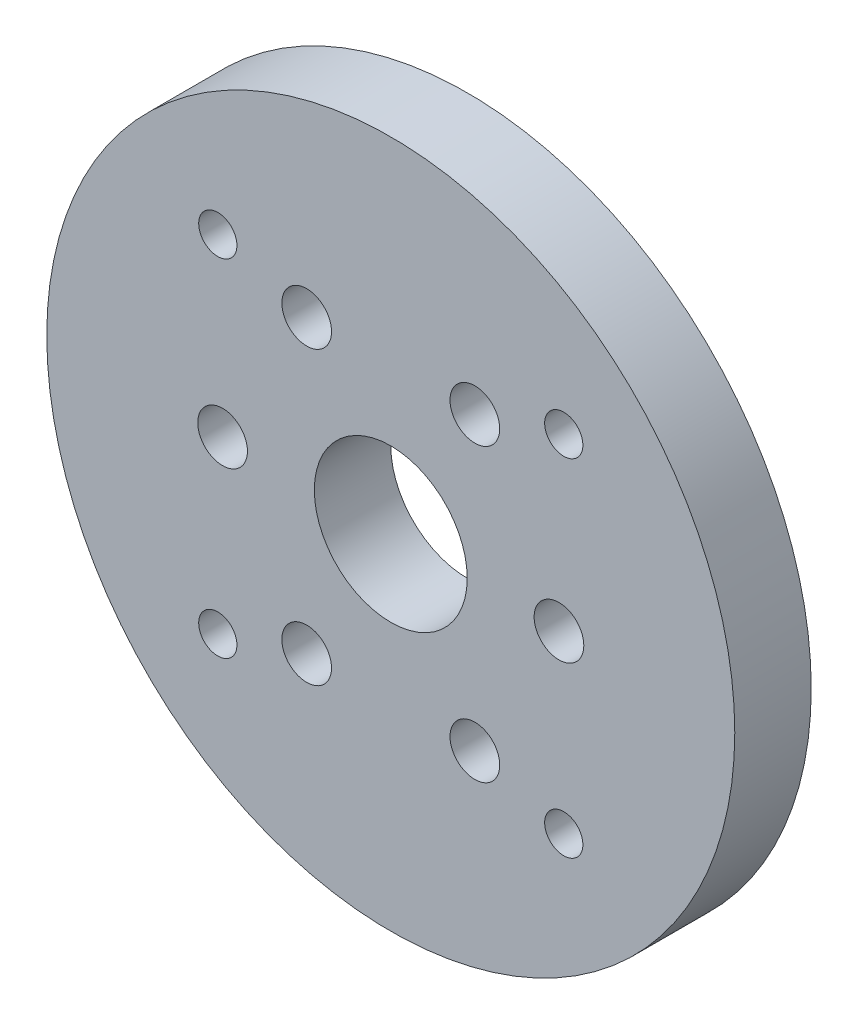
ISO-10303-21;
HEADER;
FILE_DESCRIPTION(('STEP AP214'),'2;1');
FILE_NAME('part.step','',(''),(''),'','','');
FILE_SCHEMA(('AUTOMOTIVE_DESIGN { 1 0 10303 214 1 1 1 1 }'));
ENDSEC;
DATA;
#1=APPLICATION_CONTEXT('core data for automotive mechanical design processes');
#2=APPLICATION_PROTOCOL_DEFINITION('international standard','automotive_design',2000,#1);
#3=PRODUCT_CONTEXT('',#1,'mechanical');
#4=PRODUCT('Part','Part','',(#3));
#5=PRODUCT_RELATED_PRODUCT_CATEGORY('part','',(#4));
#6=PRODUCT_DEFINITION_FORMATION('','',#4);
#7=PRODUCT_DEFINITION_CONTEXT('part definition',#1,'design');
#8=PRODUCT_DEFINITION('design','',#6,#7);
#9=PRODUCT_DEFINITION_SHAPE('','',#8);
#10=(LENGTH_UNIT() NAMED_UNIT(*) SI_UNIT(.MILLI.,.METRE.));
#11=(NAMED_UNIT(*) PLANE_ANGLE_UNIT() SI_UNIT($,.RADIAN.));
#12=(NAMED_UNIT(*) SI_UNIT($,.STERADIAN.) SOLID_ANGLE_UNIT());
#13=UNCERTAINTY_MEASURE_WITH_UNIT(LENGTH_MEASURE(1.E-05),#10,'distance_accuracy_value','');
#14=(GEOMETRIC_REPRESENTATION_CONTEXT(3) GLOBAL_UNCERTAINTY_ASSIGNED_CONTEXT((#13)) GLOBAL_UNIT_ASSIGNED_CONTEXT((#10,
#11,#12)) REPRESENTATION_CONTEXT('',''));
#15=CARTESIAN_POINT('',(0.,0.,0.));
#16=DIRECTION('',(0.,0.,1.));
#17=DIRECTION('',(1.,0.,0.));
#18=AXIS2_PLACEMENT_3D('',#15,#16,#17);
#19=CARTESIAN_POINT('',(0.,0.,10.));
#20=DIRECTION('',(0.,0.,-1.));
#21=DIRECTION('',(-1.,0.,0.));
#22=AXIS2_PLACEMENT_3D('',#19,#20,#21);
#23=CYLINDRICAL_SURFACE('',#22,45.);
#24=CARTESIAN_POINT('',(0.,0.,10.));
#25=DIRECTION('',(0.,0.,1.));
#26=DIRECTION('',(1.,0.,0.));
#27=AXIS2_PLACEMENT_3D('',#24,#25,#26);
#28=CIRCLE('',#27,45.);
#29=CARTESIAN_POINT('',(45.,0.,10.));
#30=VERTEX_POINT('',#29);
#31=EDGE_CURVE('E10',#30,#30,#28,.T.);
#32=ORIENTED_EDGE('',*,*,#31,.F.);
#33=EDGE_LOOP('',(#32));
#34=FACE_BOUND('',#33,.T.);
#35=CARTESIAN_POINT('',(0.,0.,0.));
#36=DIRECTION('',(0.,0.,1.));
#37=DIRECTION('',(1.,0.,0.));
#38=AXIS2_PLACEMENT_3D('',#35,#36,#37);
#39=CIRCLE('',#38,45.);
#40=CARTESIAN_POINT('',(45.,0.,0.));
#41=VERTEX_POINT('',#40);
#42=EDGE_CURVE('E48',#41,#41,#39,.T.);
#43=ORIENTED_EDGE('',*,*,#42,.T.);
#44=EDGE_LOOP('',(#43));
#45=FACE_BOUND('',#44,.T.);
#46=ADVANCED_FACE('F45',(#34,#45),#23,.T.);
#47=CARTESIAN_POINT('',(0.,0.,10.));
#48=DIRECTION('',(0.,0.,1.));
#49=DIRECTION('',(1.,0.,0.));
#50=AXIS2_PLACEMENT_3D('',#47,#48,#49);
#51=PLANE('',#50);
#52=CARTESIAN_POINT('',(-22.6274169979695,22.6274169979695,10.));
#53=DIRECTION('',(0.,0.,1.));
#54=DIRECTION('',(1.,0.,0.));
#55=AXIS2_PLACEMENT_3D('',#52,#53,#54);
#56=CIRCLE('',#55,2.5);
#57=CARTESIAN_POINT('',(-20.1274169979695,22.6274169979695,10.));
#58=VERTEX_POINT('',#57);
#59=EDGE_CURVE('E57',#58,#58,#56,.T.);
#60=ORIENTED_EDGE('',*,*,#59,.F.);
#61=EDGE_LOOP('',(#60));
#62=FACE_BOUND('',#61,.T.);
#63=CARTESIAN_POINT('',(22.6274169979695,22.6274169979695,10.));
#64=DIRECTION('',(0.,0.,1.));
#65=DIRECTION('',(1.,0.,0.));
#66=AXIS2_PLACEMENT_3D('',#63,#64,#65);
#67=CIRCLE('',#66,2.5);
#68=CARTESIAN_POINT('',(25.1274169979695,22.6274169979695,10.));
#69=VERTEX_POINT('',#68);
#70=EDGE_CURVE('E62',#69,#69,#67,.T.);
#71=ORIENTED_EDGE('',*,*,#70,.F.);
#72=EDGE_LOOP('',(#71));
#73=FACE_BOUND('',#72,.T.);
#74=CARTESIAN_POINT('',(11.,-19.0525588832576,10.));
#75=DIRECTION('',(0.,0.,1.));
#76=DIRECTION('',(1.,0.,0.));
#77=AXIS2_PLACEMENT_3D('',#74,#75,#76);
#78=CIRCLE('',#77,3.25);
#79=CARTESIAN_POINT('',(14.25,-19.0525588832576,10.));
#80=VERTEX_POINT('',#79);
#81=EDGE_CURVE('E66',#80,#80,#78,.T.);
#82=ORIENTED_EDGE('',*,*,#81,.F.);
#83=EDGE_LOOP('',(#82));
#84=FACE_BOUND('',#83,.T.);
#85=CARTESIAN_POINT('',(-11.,-19.0525588832576,10.));
#86=DIRECTION('',(0.,0.,1.));
#87=DIRECTION('',(1.,0.,0.));
#88=AXIS2_PLACEMENT_3D('',#85,#86,#87);
#89=CIRCLE('',#88,3.25);
#90=CARTESIAN_POINT('',(-7.75000000000001,-19.0525588832576,10.));
#91=VERTEX_POINT('',#90);
#92=EDGE_CURVE('E70',#91,#91,#89,.T.);
#93=ORIENTED_EDGE('',*,*,#92,.F.);
#94=EDGE_LOOP('',(#93));
#95=FACE_BOUND('',#94,.T.);
#96=CARTESIAN_POINT('',(-22.,0.,10.));
#97=DIRECTION('',(0.,0.,1.));
#98=DIRECTION('',(1.,0.,0.));
#99=AXIS2_PLACEMENT_3D('',#96,#97,#98);
#100=CIRCLE('',#99,3.25);
#101=CARTESIAN_POINT('',(-18.75,0.,10.));
#102=VERTEX_POINT('',#101);
#103=EDGE_CURVE('E74',#102,#102,#100,.T.);
#104=ORIENTED_EDGE('',*,*,#103,.F.);
#105=EDGE_LOOP('',(#104));
#106=FACE_BOUND('',#105,.T.);
#107=CARTESIAN_POINT('',(-11.,19.0525588832577,10.));
#108=DIRECTION('',(0.,0.,1.));
#109=DIRECTION('',(1.,0.,0.));
#110=AXIS2_PLACEMENT_3D('',#107,#108,#109);
#111=CIRCLE('',#110,3.25);
#112=CARTESIAN_POINT('',(-7.74999999999999,19.0525588832577,10.));
#113=VERTEX_POINT('',#112);
#114=EDGE_CURVE('E78',#113,#113,#111,.T.);
#115=ORIENTED_EDGE('',*,*,#114,.F.);
#116=EDGE_LOOP('',(#115));
#117=FACE_BOUND('',#116,.T.);
#118=CARTESIAN_POINT('',(11.,19.0525588832576,10.));
#119=DIRECTION('',(0.,0.,1.));
#120=DIRECTION('',(1.,0.,0.));
#121=AXIS2_PLACEMENT_3D('',#118,#119,#120);
#122=CIRCLE('',#121,3.25);
#123=CARTESIAN_POINT('',(14.25,19.0525588832576,10.));
#124=VERTEX_POINT('',#123);
#125=EDGE_CURVE('E82',#124,#124,#122,.T.);
#126=ORIENTED_EDGE('',*,*,#125,.F.);
#127=EDGE_LOOP('',(#126));
#128=FACE_BOUND('',#127,.T.);
#129=CARTESIAN_POINT('',(22.,0.,10.));
#130=DIRECTION('',(0.,0.,1.));
#131=DIRECTION('',(1.,0.,0.));
#132=AXIS2_PLACEMENT_3D('',#129,#130,#131);
#133=CIRCLE('',#132,3.25);
#134=CARTESIAN_POINT('',(25.25,0.,10.));
#135=VERTEX_POINT('',#134);
#136=EDGE_CURVE('E86',#135,#135,#133,.T.);
#137=ORIENTED_EDGE('',*,*,#136,.F.);
#138=EDGE_LOOP('',(#137));
#139=FACE_BOUND('',#138,.T.);
#140=CARTESIAN_POINT('',(-22.6274169979695,-22.6274169979695,10.));
#141=DIRECTION('',(0.,0.,1.));
#142=DIRECTION('',(1.,0.,0.));
#143=AXIS2_PLACEMENT_3D('',#140,#141,#142);
#144=CIRCLE('',#143,2.5);
#145=CARTESIAN_POINT('',(-20.1274169979695,-22.6274169979695,10.));
#146=VERTEX_POINT('',#145);
#147=EDGE_CURVE('E90',#146,#146,#144,.T.);
#148=ORIENTED_EDGE('',*,*,#147,.F.);
#149=EDGE_LOOP('',(#148));
#150=FACE_BOUND('',#149,.T.);
#151=CARTESIAN_POINT('',(22.6274169979695,-22.6274169979695,10.));
#152=DIRECTION('',(0.,0.,1.));
#153=DIRECTION('',(1.,0.,0.));
#154=AXIS2_PLACEMENT_3D('',#151,#152,#153);
#155=CIRCLE('',#154,2.5);
#156=CARTESIAN_POINT('',(25.1274169979695,-22.6274169979695,10.));
#157=VERTEX_POINT('',#156);
#158=EDGE_CURVE('E94',#157,#157,#155,.T.);
#159=ORIENTED_EDGE('',*,*,#158,.F.);
#160=EDGE_LOOP('',(#159));
#161=FACE_BOUND('',#160,.T.);
#162=CARTESIAN_POINT('',(0.,0.,10.));
#163=DIRECTION('',(0.,0.,1.));
#164=DIRECTION('',(1.,0.,0.));
#165=AXIS2_PLACEMENT_3D('',#162,#163,#164);
#166=CIRCLE('',#165,10.);
#167=CARTESIAN_POINT('',(10.,0.,10.));
#168=VERTEX_POINT('',#167);
#169=EDGE_CURVE('E98',#168,#168,#166,.T.);
#170=ORIENTED_EDGE('',*,*,#169,.F.);
#171=EDGE_LOOP('',(#170));
#172=FACE_BOUND('',#171,.T.);
#173=ORIENTED_EDGE('',*,*,#31,.T.);
#174=EDGE_LOOP('',(#173));
#175=FACE_BOUND('',#174,.T.);
#176=ADVANCED_FACE('F153',(#62,#73,#84,#95,#106,#117,#128,#139,#150,#161,#172,#175),#51,.T.);
#177=CARTESIAN_POINT('',(0.,0.,0.));
#178=DIRECTION('',(0.,0.,1.));
#179=DIRECTION('',(1.,0.,0.));
#180=AXIS2_PLACEMENT_3D('',#177,#178,#179);
#181=PLANE('',#180);
#182=CARTESIAN_POINT('',(-22.6274169979695,22.6274169979695,0.));
#183=DIRECTION('',(0.,0.,-1.));
#184=DIRECTION('',(-1.,0.,0.));
#185=AXIS2_PLACEMENT_3D('',#182,#183,#184);
#186=CIRCLE('',#185,2.5);
#187=CARTESIAN_POINT('',(-25.1274169979695,22.6274169979695,0.));
#188=VERTEX_POINT('',#187);
#189=EDGE_CURVE('E123',#188,#188,#186,.T.);
#190=ORIENTED_EDGE('',*,*,#189,.F.);
#191=EDGE_LOOP('',(#190));
#192=FACE_BOUND('',#191,.T.);
#193=CARTESIAN_POINT('',(22.6274169979695,22.6274169979695,0.));
#194=DIRECTION('',(0.,0.,-1.));
#195=DIRECTION('',(-1.,0.,0.));
#196=AXIS2_PLACEMENT_3D('',#193,#194,#195);
#197=CIRCLE('',#196,2.5);
#198=CARTESIAN_POINT('',(20.1274169979695,22.6274169979695,0.));
#199=VERTEX_POINT('',#198);
#200=EDGE_CURVE('E127',#199,#199,#197,.T.);
#201=ORIENTED_EDGE('',*,*,#200,.F.);
#202=EDGE_LOOP('',(#201));
#203=FACE_BOUND('',#202,.T.);
#204=CARTESIAN_POINT('',(11.,-19.0525588832576,0.));
#205=DIRECTION('',(0.,0.,-1.));
#206=DIRECTION('',(-1.,0.,0.));
#207=AXIS2_PLACEMENT_3D('',#204,#205,#206);
#208=CIRCLE('',#207,3.25);
#209=CARTESIAN_POINT('',(7.75,-19.0525588832576,0.));
#210=VERTEX_POINT('',#209);
#211=EDGE_CURVE('E132',#210,#210,#208,.T.);
#212=ORIENTED_EDGE('',*,*,#211,.F.);
#213=EDGE_LOOP('',(#212));
#214=FACE_BOUND('',#213,.T.);
#215=CARTESIAN_POINT('',(-11.,-19.0525588832576,0.));
#216=DIRECTION('',(0.,0.,-1.));
#217=DIRECTION('',(-1.,0.,0.));
#218=AXIS2_PLACEMENT_3D('',#215,#216,#217);
#219=CIRCLE('',#218,3.25);
#220=CARTESIAN_POINT('',(-14.25,-19.0525588832576,0.));
#221=VERTEX_POINT('',#220);
#222=EDGE_CURVE('E112',#221,#221,#219,.T.);
#223=ORIENTED_EDGE('',*,*,#222,.F.);
#224=EDGE_LOOP('',(#223));
#225=FACE_BOUND('',#224,.T.);
#226=CARTESIAN_POINT('',(-22.,0.,0.));
#227=DIRECTION('',(0.,0.,-1.));
#228=DIRECTION('',(-1.,0.,0.));
#229=AXIS2_PLACEMENT_3D('',#226,#227,#228);
#230=CIRCLE('',#229,3.25);
#231=CARTESIAN_POINT('',(-25.25,0.,0.));
#232=VERTEX_POINT('',#231);
#233=EDGE_CURVE('E107',#232,#232,#230,.T.);
#234=ORIENTED_EDGE('',*,*,#233,.F.);
#235=EDGE_LOOP('',(#234));
#236=FACE_BOUND('',#235,.T.);
#237=CARTESIAN_POINT('',(-11.,19.0525588832577,0.));
#238=DIRECTION('',(0.,0.,-1.));
#239=DIRECTION('',(-1.,0.,0.));
#240=AXIS2_PLACEMENT_3D('',#237,#238,#239);
#241=CIRCLE('',#240,3.25);
#242=CARTESIAN_POINT('',(-14.25,19.0525588832577,0.));
#243=VERTEX_POINT('',#242);
#244=EDGE_CURVE('E111',#243,#243,#241,.T.);
#245=ORIENTED_EDGE('',*,*,#244,.F.);
#246=EDGE_LOOP('',(#245));
#247=FACE_BOUND('',#246,.T.);
#248=CARTESIAN_POINT('',(11.,19.0525588832576,0.));
#249=DIRECTION('',(0.,0.,-1.));
#250=DIRECTION('',(-1.,0.,0.));
#251=AXIS2_PLACEMENT_3D('',#248,#249,#250);
#252=CIRCLE('',#251,3.25);
#253=CARTESIAN_POINT('',(7.75,19.0525588832576,0.));
#254=VERTEX_POINT('',#253);
#255=EDGE_CURVE('E116',#254,#254,#252,.T.);
#256=ORIENTED_EDGE('',*,*,#255,.F.);
#257=EDGE_LOOP('',(#256));
#258=FACE_BOUND('',#257,.T.);
#259=CARTESIAN_POINT('',(22.,0.,0.));
#260=DIRECTION('',(0.,0.,-1.));
#261=DIRECTION('',(-1.,0.,0.));
#262=AXIS2_PLACEMENT_3D('',#259,#260,#261);
#263=CIRCLE('',#262,3.25);
#264=CARTESIAN_POINT('',(18.75,0.,0.));
#265=VERTEX_POINT('',#264);
#266=EDGE_CURVE('E106',#265,#265,#263,.T.);
#267=ORIENTED_EDGE('',*,*,#266,.F.);
#268=EDGE_LOOP('',(#267));
#269=FACE_BOUND('',#268,.T.);
#270=CARTESIAN_POINT('',(-22.6274169979695,-22.6274169979695,0.));
#271=DIRECTION('',(0.,0.,-1.));
#272=DIRECTION('',(-1.,0.,0.));
#273=AXIS2_PLACEMENT_3D('',#270,#271,#272);
#274=CIRCLE('',#273,2.5);
#275=CARTESIAN_POINT('',(-25.1274169979695,-22.6274169979695,0.));
#276=VERTEX_POINT('',#275);
#277=EDGE_CURVE('E128',#276,#276,#274,.T.);
#278=ORIENTED_EDGE('',*,*,#277,.F.);
#279=EDGE_LOOP('',(#278));
#280=FACE_BOUND('',#279,.T.);
#281=CARTESIAN_POINT('',(22.6274169979695,-22.6274169979695,0.));
#282=DIRECTION('',(0.,0.,-1.));
#283=DIRECTION('',(-1.,0.,0.));
#284=AXIS2_PLACEMENT_3D('',#281,#282,#283);
#285=CIRCLE('',#284,2.5);
#286=CARTESIAN_POINT('',(20.1274169979695,-22.6274169979695,0.));
#287=VERTEX_POINT('',#286);
#288=EDGE_CURVE('E139',#287,#287,#285,.T.);
#289=ORIENTED_EDGE('',*,*,#288,.F.);
#290=EDGE_LOOP('',(#289));
#291=FACE_BOUND('',#290,.T.);
#292=CARTESIAN_POINT('',(0.,0.,0.));
#293=DIRECTION('',(0.,0.,-1.));
#294=DIRECTION('',(-1.,0.,0.));
#295=AXIS2_PLACEMENT_3D('',#292,#293,#294);
#296=CIRCLE('',#295,10.);
#297=CARTESIAN_POINT('',(-10.,0.,0.));
#298=VERTEX_POINT('',#297);
#299=EDGE_CURVE('E102',#298,#298,#296,.T.);
#300=ORIENTED_EDGE('',*,*,#299,.F.);
#301=EDGE_LOOP('',(#300));
#302=FACE_BOUND('',#301,.T.);
#303=ORIENTED_EDGE('',*,*,#42,.F.);
#304=EDGE_LOOP('',(#303));
#305=FACE_BOUND('',#304,.T.);
#306=ADVANCED_FACE('F149',(#192,#203,#214,#225,#236,#247,#258,#269,#280,#291,#302,#305),#181,.F.);
#307=CARTESIAN_POINT('',(0.,0.,11.));
#308=DIRECTION('',(0.,0.,-1.));
#309=DIRECTION('',(-1.,0.,0.));
#310=AXIS2_PLACEMENT_3D('',#307,#308,#309);
#311=CYLINDRICAL_SURFACE('',#310,10.);
#312=ORIENTED_EDGE('',*,*,#169,.T.);
#313=EDGE_LOOP('',(#312));
#314=FACE_BOUND('',#313,.T.);
#315=ORIENTED_EDGE('',*,*,#299,.T.);
#316=EDGE_LOOP('',(#315));
#317=FACE_BOUND('',#316,.T.);
#318=ADVANCED_FACE('F152',(#314,#317),#311,.F.);
#319=CARTESIAN_POINT('',(22.6274169979695,-22.6274169979695,11.));
#320=DIRECTION('',(0.,0.,-1.));
#321=DIRECTION('',(-1.,0.,0.));
#322=AXIS2_PLACEMENT_3D('',#319,#320,#321);
#323=CYLINDRICAL_SURFACE('',#322,2.5);
#324=ORIENTED_EDGE('',*,*,#158,.T.);
#325=EDGE_LOOP('',(#324));
#326=FACE_BOUND('',#325,.T.);
#327=ORIENTED_EDGE('',*,*,#288,.T.);
#328=EDGE_LOOP('',(#327));
#329=FACE_BOUND('',#328,.T.);
#330=ADVANCED_FACE('F175',(#326,#329),#323,.F.);
#331=CARTESIAN_POINT('',(-22.6274169979695,-22.6274169979695,11.));
#332=DIRECTION('',(0.,0.,-1.));
#333=DIRECTION('',(-1.,0.,0.));
#334=AXIS2_PLACEMENT_3D('',#331,#332,#333);
#335=CYLINDRICAL_SURFACE('',#334,2.5);
#336=ORIENTED_EDGE('',*,*,#147,.T.);
#337=EDGE_LOOP('',(#336));
#338=FACE_BOUND('',#337,.T.);
#339=ORIENTED_EDGE('',*,*,#277,.T.);
#340=EDGE_LOOP('',(#339));
#341=FACE_BOUND('',#340,.T.);
#342=ADVANCED_FACE('F147',(#338,#341),#335,.F.);
#343=CARTESIAN_POINT('',(22.,0.,11.));
#344=DIRECTION('',(0.,0.,-1.));
#345=DIRECTION('',(-1.,0.,0.));
#346=AXIS2_PLACEMENT_3D('',#343,#344,#345);
#347=CYLINDRICAL_SURFACE('',#346,3.25);
#348=ORIENTED_EDGE('',*,*,#136,.T.);
#349=EDGE_LOOP('',(#348));
#350=FACE_BOUND('',#349,.T.);
#351=ORIENTED_EDGE('',*,*,#266,.T.);
#352=EDGE_LOOP('',(#351));
#353=FACE_BOUND('',#352,.T.);
#354=ADVANCED_FACE('F189',(#350,#353),#347,.F.);
#355=CARTESIAN_POINT('',(11.,19.0525588832576,11.));
#356=DIRECTION('',(0.,0.,-1.));
#357=DIRECTION('',(-1.,0.,0.));
#358=AXIS2_PLACEMENT_3D('',#355,#356,#357);
#359=CYLINDRICAL_SURFACE('',#358,3.25);
#360=ORIENTED_EDGE('',*,*,#125,.T.);
#361=EDGE_LOOP('',(#360));
#362=FACE_BOUND('',#361,.T.);
#363=ORIENTED_EDGE('',*,*,#255,.T.);
#364=EDGE_LOOP('',(#363));
#365=FACE_BOUND('',#364,.T.);
#366=ADVANCED_FACE('F185',(#362,#365),#359,.F.);
#367=CARTESIAN_POINT('',(-11.,19.0525588832577,11.));
#368=DIRECTION('',(0.,0.,-1.));
#369=DIRECTION('',(-1.,0.,0.));
#370=AXIS2_PLACEMENT_3D('',#367,#368,#369);
#371=CYLINDRICAL_SURFACE('',#370,3.25);
#372=ORIENTED_EDGE('',*,*,#114,.T.);
#373=EDGE_LOOP('',(#372));
#374=FACE_BOUND('',#373,.T.);
#375=ORIENTED_EDGE('',*,*,#244,.T.);
#376=EDGE_LOOP('',(#375));
#377=FACE_BOUND('',#376,.T.);
#378=ADVANCED_FACE('F181',(#374,#377),#371,.F.);
#379=CARTESIAN_POINT('',(-22.,0.,11.));
#380=DIRECTION('',(0.,0.,-1.));
#381=DIRECTION('',(-1.,0.,0.));
#382=AXIS2_PLACEMENT_3D('',#379,#380,#381);
#383=CYLINDRICAL_SURFACE('',#382,3.25);
#384=ORIENTED_EDGE('',*,*,#103,.T.);
#385=EDGE_LOOP('',(#384));
#386=FACE_BOUND('',#385,.T.);
#387=ORIENTED_EDGE('',*,*,#233,.T.);
#388=EDGE_LOOP('',(#387));
#389=FACE_BOUND('',#388,.T.);
#390=ADVANCED_FACE('F177',(#386,#389),#383,.F.);
#391=CARTESIAN_POINT('',(-11.,-19.0525588832576,11.));
#392=DIRECTION('',(0.,0.,-1.));
#393=DIRECTION('',(-1.,0.,0.));
#394=AXIS2_PLACEMENT_3D('',#391,#392,#393);
#395=CYLINDRICAL_SURFACE('',#394,3.25);
#396=ORIENTED_EDGE('',*,*,#92,.T.);
#397=EDGE_LOOP('',(#396));
#398=FACE_BOUND('',#397,.T.);
#399=ORIENTED_EDGE('',*,*,#222,.T.);
#400=EDGE_LOOP('',(#399));
#401=FACE_BOUND('',#400,.T.);
#402=ADVANCED_FACE('F180',(#398,#401),#395,.F.);
#403=CARTESIAN_POINT('',(11.,-19.0525588832576,11.));
#404=DIRECTION('',(0.,0.,-1.));
#405=DIRECTION('',(-1.,0.,0.));
#406=AXIS2_PLACEMENT_3D('',#403,#404,#405);
#407=CYLINDRICAL_SURFACE('',#406,3.25);
#408=ORIENTED_EDGE('',*,*,#81,.T.);
#409=EDGE_LOOP('',(#408));
#410=FACE_BOUND('',#409,.T.);
#411=ORIENTED_EDGE('',*,*,#211,.T.);
#412=EDGE_LOOP('',(#411));
#413=FACE_BOUND('',#412,.T.);
#414=ADVANCED_FACE('F201',(#410,#413),#407,.F.);
#415=CARTESIAN_POINT('',(22.6274169979695,22.6274169979695,11.));
#416=DIRECTION('',(0.,0.,-1.));
#417=DIRECTION('',(-1.,0.,0.));
#418=AXIS2_PLACEMENT_3D('',#415,#416,#417);
#419=CYLINDRICAL_SURFACE('',#418,2.5);
#420=ORIENTED_EDGE('',*,*,#70,.T.);
#421=EDGE_LOOP('',(#420));
#422=FACE_BOUND('',#421,.T.);
#423=ORIENTED_EDGE('',*,*,#200,.T.);
#424=EDGE_LOOP('',(#423));
#425=FACE_BOUND('',#424,.T.);
#426=ADVANCED_FACE('F197',(#422,#425),#419,.F.);
#427=CARTESIAN_POINT('',(-22.6274169979695,22.6274169979695,11.));
#428=DIRECTION('',(0.,0.,-1.));
#429=DIRECTION('',(-1.,0.,0.));
#430=AXIS2_PLACEMENT_3D('',#427,#428,#429);
#431=CYLINDRICAL_SURFACE('',#430,2.5);
#432=ORIENTED_EDGE('',*,*,#59,.T.);
#433=EDGE_LOOP('',(#432));
#434=FACE_BOUND('',#433,.T.);
#435=ORIENTED_EDGE('',*,*,#189,.T.);
#436=EDGE_LOOP('',(#435));
#437=FACE_BOUND('',#436,.T.);
#438=ADVANCED_FACE('F194',(#434,#437),#431,.F.);
#439=CLOSED_SHELL('',(#46,#176,#306,#318,#330,#342,#354,#366,#378,#390,#402,#414,#426,#438));
#440=MANIFOLD_SOLID_BREP('B2',#439);
#441=ADVANCED_BREP_SHAPE_REPRESENTATION('',(#18,#440),#14);
#442=SHAPE_DEFINITION_REPRESENTATION(#9,#441);
ENDSEC;
END-ISO-10303-21;
